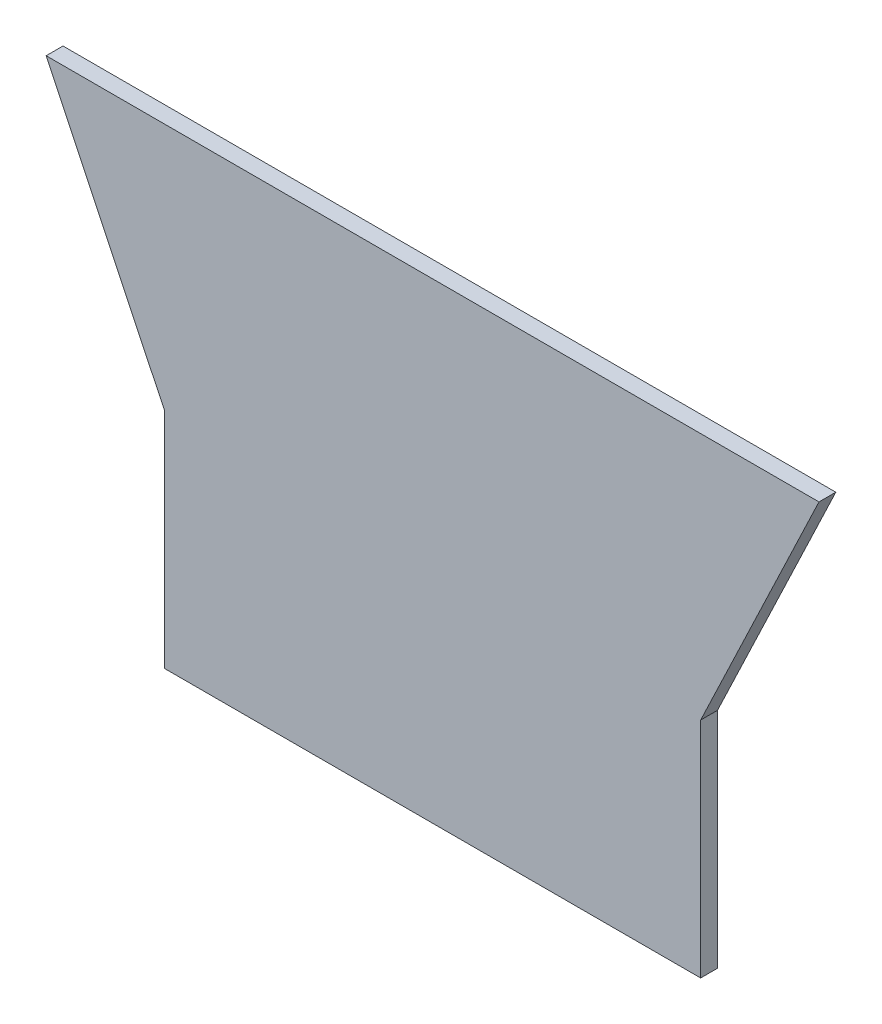
ISO-10303-21;
HEADER;
FILE_DESCRIPTION(('STEP AP214'),'2;1');
FILE_NAME('part.step','',(''),(''),'','','');
FILE_SCHEMA(('AUTOMOTIVE_DESIGN { 1 0 10303 214 1 1 1 1 }'));
ENDSEC;
DATA;
#1=APPLICATION_CONTEXT('core data for automotive mechanical design processes');
#2=APPLICATION_PROTOCOL_DEFINITION('international standard','automotive_design',2000,#1);
#3=PRODUCT_CONTEXT('',#1,'mechanical');
#4=PRODUCT('Part','Part','',(#3));
#5=PRODUCT_RELATED_PRODUCT_CATEGORY('part','',(#4));
#6=PRODUCT_DEFINITION_FORMATION('','',#4);
#7=PRODUCT_DEFINITION_CONTEXT('part definition',#1,'design');
#8=PRODUCT_DEFINITION('design','',#6,#7);
#9=PRODUCT_DEFINITION_SHAPE('','',#8);
#10=(LENGTH_UNIT() NAMED_UNIT(*) SI_UNIT(.MILLI.,.METRE.));
#11=(NAMED_UNIT(*) PLANE_ANGLE_UNIT() SI_UNIT($,.RADIAN.));
#12=(NAMED_UNIT(*) SI_UNIT($,.STERADIAN.) SOLID_ANGLE_UNIT());
#13=UNCERTAINTY_MEASURE_WITH_UNIT(LENGTH_MEASURE(1.E-05),#10,'distance_accuracy_value','');
#14=(GEOMETRIC_REPRESENTATION_CONTEXT(3) GLOBAL_UNCERTAINTY_ASSIGNED_CONTEXT((#13)) GLOBAL_UNIT_ASSIGNED_CONTEXT((#10,
#11,#12)) REPRESENTATION_CONTEXT('',''));
#15=CARTESIAN_POINT('',(0.,0.,0.));
#16=DIRECTION('',(0.,0.,1.));
#17=DIRECTION('',(1.,0.,0.));
#18=AXIS2_PLACEMENT_3D('',#15,#16,#17);
#19=CARTESIAN_POINT('',(72.8590990990991,67.8391666666667,3.175));
#20=DIRECTION('',(0.,-1.,0.));
#21=DIRECTION('',(0.,0.,-1.));
#22=AXIS2_PLACEMENT_3D('',#19,#20,#21);
#23=PLANE('',#22);
#24=DIRECTION('',(-1.,0.,0.));
#25=VECTOR('',#24,1.);
#26=CARTESIAN_POINT('',(72.8590990990991,67.8391666666667,0.));
#27=LINE('',#26,#25);
#28=CARTESIAN_POINT('',(72.8590990990991,67.8391666666667,0.));
#29=VERTEX_POINT('',#28);
#30=CARTESIAN_POINT('',(-72.8590990990991,67.8391666666667,0.));
#31=VERTEX_POINT('',#30);
#32=EDGE_CURVE('E128',#29,#31,#27,.T.);
#33=ORIENTED_EDGE('',*,*,#32,.T.);
#34=DIRECTION('',(0.,0.,-1.));
#35=VECTOR('',#34,1.);
#36=CARTESIAN_POINT('',(-72.8590990990991,67.8391666666667,3.175));
#37=LINE('',#36,#35);
#38=CARTESIAN_POINT('',(-72.8590990990991,67.8391666666667,3.175));
#39=VERTEX_POINT('',#38);
#40=EDGE_CURVE('E11',#39,#31,#37,.T.);
#41=ORIENTED_EDGE('',*,*,#40,.F.);
#42=DIRECTION('',(-1.,0.,0.));
#43=VECTOR('',#42,1.);
#44=CARTESIAN_POINT('',(72.8590990990991,67.8391666666667,3.175));
#45=LINE('',#44,#43);
#46=CARTESIAN_POINT('',(72.8590990990991,67.8391666666667,3.175));
#47=VERTEX_POINT('',#46);
#48=EDGE_CURVE('E144',#47,#39,#45,.T.);
#49=ORIENTED_EDGE('',*,*,#48,.F.);
#50=DIRECTION('',(0.,0.,-1.));
#51=VECTOR('',#50,1.);
#52=CARTESIAN_POINT('',(72.8590990990991,67.8391666666667,3.175));
#53=LINE('',#52,#51);
#54=EDGE_CURVE('E124',#47,#29,#53,.T.);
#55=ORIENTED_EDGE('',*,*,#54,.T.);
#56=EDGE_LOOP('',(#33,#41,#49,#55));
#57=FACE_BOUND('',#56,.T.);
#58=ADVANCED_FACE('F39',(#57),#23,.F.);
#59=CARTESIAN_POINT('',(-72.8590990990991,67.8391666666667,3.175));
#60=DIRECTION('',(0.902577946941039,0.430526479668439,0.));
#61=DIRECTION('',(-0.430526479668439,0.902577946941039,0.));
#62=AXIS2_PLACEMENT_3D('',#59,#60,#61);
#63=PLANE('',#62);
#64=DIRECTION('',(0.430526479668439,-0.902577946941039,0.));
#65=VECTOR('',#64,1.);
#66=CARTESIAN_POINT('',(-72.8590990990991,67.8391666666667,0.));
#67=LINE('',#66,#65);
#68=CARTESIAN_POINT('',(-50.546,21.0608333333333,0.));
#69=VERTEX_POINT('',#68);
#70=EDGE_CURVE('E132',#31,#69,#67,.T.);
#71=ORIENTED_EDGE('',*,*,#70,.T.);
#72=DIRECTION('',(0.,0.,-1.));
#73=VECTOR('',#72,1.);
#74=CARTESIAN_POINT('',(-50.546,21.0608333333333,3.175));
#75=LINE('',#74,#73);
#76=CARTESIAN_POINT('',(-50.546,21.0608333333333,3.175));
#77=VERTEX_POINT('',#76);
#78=EDGE_CURVE('E48',#77,#69,#75,.T.);
#79=ORIENTED_EDGE('',*,*,#78,.F.);
#80=DIRECTION('',(0.430526479668439,-0.902577946941039,0.));
#81=VECTOR('',#80,1.);
#82=CARTESIAN_POINT('',(-72.8590990990991,67.8391666666667,3.175));
#83=LINE('',#82,#81);
#84=EDGE_CURVE('E93',#39,#77,#83,.T.);
#85=ORIENTED_EDGE('',*,*,#84,.F.);
#86=ORIENTED_EDGE('',*,*,#40,.T.);
#87=EDGE_LOOP('',(#71,#79,#85,#86));
#88=FACE_BOUND('',#87,.T.);
#89=ADVANCED_FACE('F172',(#88),#63,.F.);
#90=CARTESIAN_POINT('',(-50.546,21.0608333333333,3.175));
#91=DIRECTION('',(1.,0.,0.));
#92=DIRECTION('',(0.,0.,-1.));
#93=AXIS2_PLACEMENT_3D('',#90,#91,#92);
#94=PLANE('',#93);
#95=DIRECTION('',(0.,-1.,0.));
#96=VECTOR('',#95,1.);
#97=CARTESIAN_POINT('',(-50.546,21.0608333333333,0.));
#98=LINE('',#97,#96);
#99=CARTESIAN_POINT('',(-50.546,-21.0608333333333,0.));
#100=VERTEX_POINT('',#99);
#101=EDGE_CURVE('E135',#69,#100,#98,.T.);
#102=ORIENTED_EDGE('',*,*,#101,.T.);
#103=DIRECTION('',(0.,0.,-1.));
#104=VECTOR('',#103,1.);
#105=CARTESIAN_POINT('',(-50.546,-21.0608333333333,3.175));
#106=LINE('',#105,#104);
#107=CARTESIAN_POINT('',(-50.546,-21.0608333333333,3.175));
#108=VERTEX_POINT('',#107);
#109=EDGE_CURVE('E117',#108,#100,#106,.T.);
#110=ORIENTED_EDGE('',*,*,#109,.F.);
#111=DIRECTION('',(0.,-1.,0.));
#112=VECTOR('',#111,1.);
#113=CARTESIAN_POINT('',(-50.546,21.0608333333333,3.175));
#114=LINE('',#113,#112);
#115=EDGE_CURVE('E106',#77,#108,#114,.T.);
#116=ORIENTED_EDGE('',*,*,#115,.F.);
#117=ORIENTED_EDGE('',*,*,#78,.T.);
#118=EDGE_LOOP('',(#102,#110,#116,#117));
#119=FACE_BOUND('',#118,.T.);
#120=ADVANCED_FACE('F154',(#119),#94,.F.);
#121=CARTESIAN_POINT('',(-50.546,-21.0608333333333,3.175));
#122=DIRECTION('',(0.,1.,0.));
#123=DIRECTION('',(0.,0.,1.));
#124=AXIS2_PLACEMENT_3D('',#121,#122,#123);
#125=PLANE('',#124);
#126=DIRECTION('',(1.,0.,0.));
#127=VECTOR('',#126,1.);
#128=CARTESIAN_POINT('',(-50.546,-21.0608333333333,0.));
#129=LINE('',#128,#127);
#130=CARTESIAN_POINT('',(50.546,-21.0608333333333,0.));
#131=VERTEX_POINT('',#130);
#132=EDGE_CURVE('E115',#100,#131,#129,.T.);
#133=ORIENTED_EDGE('',*,*,#132,.T.);
#134=DIRECTION('',(0.,0.,-1.));
#135=VECTOR('',#134,1.);
#136=CARTESIAN_POINT('',(50.546,-21.0608333333333,3.175));
#137=LINE('',#136,#135);
#138=CARTESIAN_POINT('',(50.546,-21.0608333333333,3.175));
#139=VERTEX_POINT('',#138);
#140=EDGE_CURVE('E112',#139,#131,#137,.T.);
#141=ORIENTED_EDGE('',*,*,#140,.F.);
#142=DIRECTION('',(1.,0.,0.));
#143=VECTOR('',#142,1.);
#144=CARTESIAN_POINT('',(-50.546,-21.0608333333333,3.175));
#145=LINE('',#144,#143);
#146=EDGE_CURVE('E100',#108,#139,#145,.T.);
#147=ORIENTED_EDGE('',*,*,#146,.F.);
#148=ORIENTED_EDGE('',*,*,#109,.T.);
#149=EDGE_LOOP('',(#133,#141,#147,#148));
#150=FACE_BOUND('',#149,.T.);
#151=ADVANCED_FACE('F113',(#150),#125,.F.);
#152=CARTESIAN_POINT('',(50.546,-21.0608333333333,3.175));
#153=DIRECTION('',(-1.,0.,0.));
#154=DIRECTION('',(0.,0.,1.));
#155=AXIS2_PLACEMENT_3D('',#152,#153,#154);
#156=PLANE('',#155);
#157=DIRECTION('',(0.,1.,0.));
#158=VECTOR('',#157,1.);
#159=CARTESIAN_POINT('',(50.546,-21.0608333333333,0.));
#160=LINE('',#159,#158);
#161=CARTESIAN_POINT('',(50.546,21.0608333333333,0.));
#162=VERTEX_POINT('',#161);
#163=EDGE_CURVE('E79',#131,#162,#160,.T.);
#164=ORIENTED_EDGE('',*,*,#163,.T.);
#165=DIRECTION('',(0.,0.,-1.));
#166=VECTOR('',#165,1.);
#167=CARTESIAN_POINT('',(50.546,21.0608333333333,3.175));
#168=LINE('',#167,#166);
#169=CARTESIAN_POINT('',(50.546,21.0608333333333,3.175));
#170=VERTEX_POINT('',#169);
#171=EDGE_CURVE('E118',#170,#162,#168,.T.);
#172=ORIENTED_EDGE('',*,*,#171,.F.);
#173=DIRECTION('',(0.,1.,0.));
#174=VECTOR('',#173,1.);
#175=CARTESIAN_POINT('',(50.546,-21.0608333333333,3.175));
#176=LINE('',#175,#174);
#177=EDGE_CURVE('E104',#139,#170,#176,.T.);
#178=ORIENTED_EDGE('',*,*,#177,.F.);
#179=ORIENTED_EDGE('',*,*,#140,.T.);
#180=EDGE_LOOP('',(#164,#172,#178,#179));
#181=FACE_BOUND('',#180,.T.);
#182=ADVANCED_FACE('F120',(#181),#156,.F.);
#183=CARTESIAN_POINT('',(50.546,21.0608333333333,3.175));
#184=DIRECTION('',(-0.902577946941039,0.430526479668439,0.));
#185=DIRECTION('',(-0.430526479668439,-0.902577946941039,0.));
#186=AXIS2_PLACEMENT_3D('',#183,#184,#185);
#187=PLANE('',#186);
#188=DIRECTION('',(0.430526479668439,0.902577946941039,0.));
#189=VECTOR('',#188,1.);
#190=CARTESIAN_POINT('',(50.546,21.0608333333333,0.));
#191=LINE('',#190,#189);
#192=EDGE_CURVE('E85',#162,#29,#191,.T.);
#193=ORIENTED_EDGE('',*,*,#192,.T.);
#194=ORIENTED_EDGE('',*,*,#54,.F.);
#195=DIRECTION('',(0.430526479668439,0.902577946941039,0.));
#196=VECTOR('',#195,1.);
#197=CARTESIAN_POINT('',(50.546,21.0608333333333,3.175));
#198=LINE('',#197,#196);
#199=EDGE_CURVE('E56',#170,#47,#198,.T.);
#200=ORIENTED_EDGE('',*,*,#199,.F.);
#201=ORIENTED_EDGE('',*,*,#171,.T.);
#202=EDGE_LOOP('',(#193,#194,#200,#201));
#203=FACE_BOUND('',#202,.T.);
#204=ADVANCED_FACE('F161',(#203),#187,.F.);
#205=CARTESIAN_POINT('',(0.,0.,3.175));
#206=DIRECTION('',(0.,0.,1.));
#207=DIRECTION('',(1.,0.,0.));
#208=AXIS2_PLACEMENT_3D('',#205,#206,#207);
#209=PLANE('',#208);
#210=ORIENTED_EDGE('',*,*,#48,.T.);
#211=ORIENTED_EDGE('',*,*,#84,.T.);
#212=ORIENTED_EDGE('',*,*,#115,.T.);
#213=ORIENTED_EDGE('',*,*,#146,.T.);
#214=ORIENTED_EDGE('',*,*,#177,.T.);
#215=ORIENTED_EDGE('',*,*,#199,.T.);
#216=EDGE_LOOP('',(#210,#211,#212,#213,#214,#215));
#217=FACE_BOUND('',#216,.T.);
#218=ADVANCED_FACE('F102',(#217),#209,.T.);
#219=CARTESIAN_POINT('',(0.,0.,0.));
#220=DIRECTION('',(0.,0.,1.));
#221=DIRECTION('',(1.,0.,0.));
#222=AXIS2_PLACEMENT_3D('',#219,#220,#221);
#223=PLANE('',#222);
#224=ORIENTED_EDGE('',*,*,#32,.F.);
#225=ORIENTED_EDGE('',*,*,#192,.F.);
#226=ORIENTED_EDGE('',*,*,#163,.F.);
#227=ORIENTED_EDGE('',*,*,#132,.F.);
#228=ORIENTED_EDGE('',*,*,#101,.F.);
#229=ORIENTED_EDGE('',*,*,#70,.F.);
#230=EDGE_LOOP('',(#224,#225,#226,#227,#228,#229));
#231=FACE_BOUND('',#230,.T.);
#232=ADVANCED_FACE('F157',(#231),#223,.F.);
#233=CLOSED_SHELL('',(#58,#89,#120,#151,#182,#204,#218,#232));
#234=MANIFOLD_SOLID_BREP('B2',#233);
#235=ADVANCED_BREP_SHAPE_REPRESENTATION('',(#18,#234),#14);
#236=SHAPE_DEFINITION_REPRESENTATION(#9,#235);
ENDSEC;
END-ISO-10303-21;
